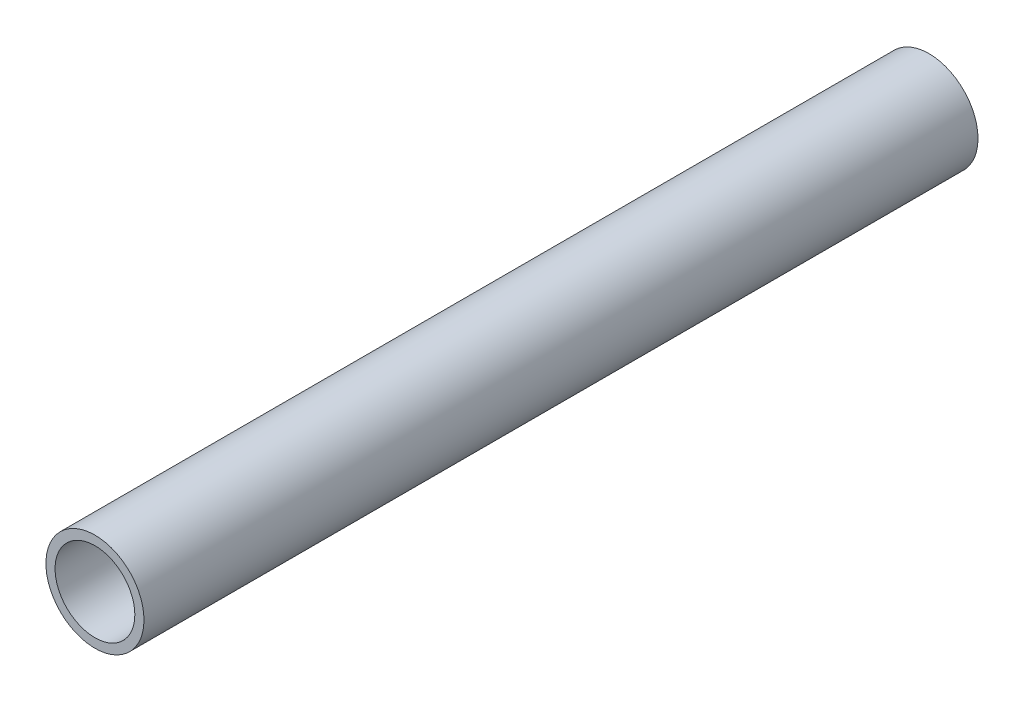
ISO-10303-21;
HEADER;
FILE_DESCRIPTION(('STEP AP214'),'2;1');
FILE_NAME('part.step','',(''),(''),'','','');
FILE_SCHEMA(('AUTOMOTIVE_DESIGN { 1 0 10303 214 1 1 1 1 }'));
ENDSEC;
DATA;
#1=APPLICATION_CONTEXT('core data for automotive mechanical design processes');
#2=APPLICATION_PROTOCOL_DEFINITION('international standard','automotive_design',2000,#1);
#3=PRODUCT_CONTEXT('',#1,'mechanical');
#4=PRODUCT('Part','Part','',(#3));
#5=PRODUCT_RELATED_PRODUCT_CATEGORY('part','',(#4));
#6=PRODUCT_DEFINITION_FORMATION('','',#4);
#7=PRODUCT_DEFINITION_CONTEXT('part definition',#1,'design');
#8=PRODUCT_DEFINITION('design','',#6,#7);
#9=PRODUCT_DEFINITION_SHAPE('','',#8);
#10=(LENGTH_UNIT() NAMED_UNIT(*) SI_UNIT(.MILLI.,.METRE.));
#11=(NAMED_UNIT(*) PLANE_ANGLE_UNIT() SI_UNIT($,.RADIAN.));
#12=(NAMED_UNIT(*) SI_UNIT($,.STERADIAN.) SOLID_ANGLE_UNIT());
#13=UNCERTAINTY_MEASURE_WITH_UNIT(LENGTH_MEASURE(1.E-05),#10,'distance_accuracy_value','');
#14=(GEOMETRIC_REPRESENTATION_CONTEXT(3) GLOBAL_UNCERTAINTY_ASSIGNED_CONTEXT((#13)) GLOBAL_UNIT_ASSIGNED_CONTEXT((#10,
#11,#12)) REPRESENTATION_CONTEXT('',''));
#15=CARTESIAN_POINT('',(0.,0.,0.));
#16=DIRECTION('',(0.,0.,1.));
#17=DIRECTION('',(1.,0.,0.));
#18=AXIS2_PLACEMENT_3D('',#15,#16,#17);
#19=CARTESIAN_POINT('',(0.,0.,81.));
#20=DIRECTION('',(0.,0.,1.));
#21=DIRECTION('',(1.,0.,0.));
#22=AXIS2_PLACEMENT_3D('',#19,#20,#21);
#23=PLANE('',#22);
#24=CARTESIAN_POINT('',(0.,0.,81.));
#25=DIRECTION('',(0.,0.,1.));
#26=DIRECTION('',(1.,0.,0.));
#27=AXIS2_PLACEMENT_3D('',#24,#25,#26);
#28=CIRCLE('',#27,4.7625);
#29=CARTESIAN_POINT('',(4.7625,0.,81.));
#30=VERTEX_POINT('',#29);
#31=EDGE_CURVE('E10',#30,#30,#28,.T.);
#32=ORIENTED_EDGE('',*,*,#31,.T.);
#33=EDGE_LOOP('',(#32));
#34=FACE_BOUND('',#33,.T.);
#35=CARTESIAN_POINT('',(0.,0.,81.));
#36=DIRECTION('',(0.,0.,1.));
#37=DIRECTION('',(1.,0.,0.));
#38=AXIS2_PLACEMENT_3D('',#35,#36,#37);
#39=CIRCLE('',#38,3.8735);
#40=CARTESIAN_POINT('',(3.8735,0.,81.));
#41=VERTEX_POINT('',#40);
#42=EDGE_CURVE('E43',#41,#41,#39,.T.);
#43=ORIENTED_EDGE('',*,*,#42,.F.);
#44=EDGE_LOOP('',(#43));
#45=FACE_BOUND('',#44,.T.);
#46=ADVANCED_FACE('F32',(#34,#45),#23,.T.);
#47=CARTESIAN_POINT('',(0.,0.,0.));
#48=DIRECTION('',(0.,0.,1.));
#49=DIRECTION('',(1.,0.,0.));
#50=AXIS2_PLACEMENT_3D('',#47,#48,#49);
#51=PLANE('',#50);
#52=CARTESIAN_POINT('',(0.,0.,0.));
#53=DIRECTION('',(0.,0.,1.));
#54=DIRECTION('',(1.,0.,0.));
#55=AXIS2_PLACEMENT_3D('',#52,#53,#54);
#56=CIRCLE('',#55,4.7625);
#57=CARTESIAN_POINT('',(4.7625,0.,0.));
#58=VERTEX_POINT('',#57);
#59=EDGE_CURVE('E36',#58,#58,#56,.T.);
#60=ORIENTED_EDGE('',*,*,#59,.F.);
#61=EDGE_LOOP('',(#60));
#62=FACE_BOUND('',#61,.T.);
#63=CARTESIAN_POINT('',(0.,0.,0.));
#64=DIRECTION('',(0.,0.,1.));
#65=DIRECTION('',(1.,0.,0.));
#66=AXIS2_PLACEMENT_3D('',#63,#64,#65);
#67=CIRCLE('',#66,3.8735);
#68=CARTESIAN_POINT('',(3.8735,0.,0.));
#69=VERTEX_POINT('',#68);
#70=EDGE_CURVE('E45',#69,#69,#67,.T.);
#71=ORIENTED_EDGE('',*,*,#70,.T.);
#72=EDGE_LOOP('',(#71));
#73=FACE_BOUND('',#72,.T.);
#74=ADVANCED_FACE('F55',(#62,#73),#51,.F.);
#75=CARTESIAN_POINT('',(0.,0.,81.));
#76=DIRECTION('',(0.,0.,-1.));
#77=DIRECTION('',(-1.,0.,0.));
#78=AXIS2_PLACEMENT_3D('',#75,#76,#77);
#79=CYLINDRICAL_SURFACE('',#78,4.7625);
#80=ORIENTED_EDGE('',*,*,#31,.F.);
#81=EDGE_LOOP('',(#80));
#82=FACE_BOUND('',#81,.T.);
#83=ORIENTED_EDGE('',*,*,#59,.T.);
#84=EDGE_LOOP('',(#83));
#85=FACE_BOUND('',#84,.T.);
#86=ADVANCED_FACE('F34',(#82,#85),#79,.T.);
#87=CARTESIAN_POINT('',(0.,0.,81.));
#88=DIRECTION('',(0.,0.,-1.));
#89=DIRECTION('',(-1.,0.,0.));
#90=AXIS2_PLACEMENT_3D('',#87,#88,#89);
#91=CYLINDRICAL_SURFACE('',#90,3.8735);
#92=ORIENTED_EDGE('',*,*,#42,.T.);
#93=EDGE_LOOP('',(#92));
#94=FACE_BOUND('',#93,.T.);
#95=ORIENTED_EDGE('',*,*,#70,.F.);
#96=EDGE_LOOP('',(#95));
#97=FACE_BOUND('',#96,.T.);
#98=ADVANCED_FACE('F51',(#94,#97),#91,.F.);
#99=CLOSED_SHELL('',(#46,#74,#86,#98));
#100=MANIFOLD_SOLID_BREP('B2',#99);
#101=ADVANCED_BREP_SHAPE_REPRESENTATION('',(#18,#100),#14);
#102=SHAPE_DEFINITION_REPRESENTATION(#9,#101);
ENDSEC;
END-ISO-10303-21;
